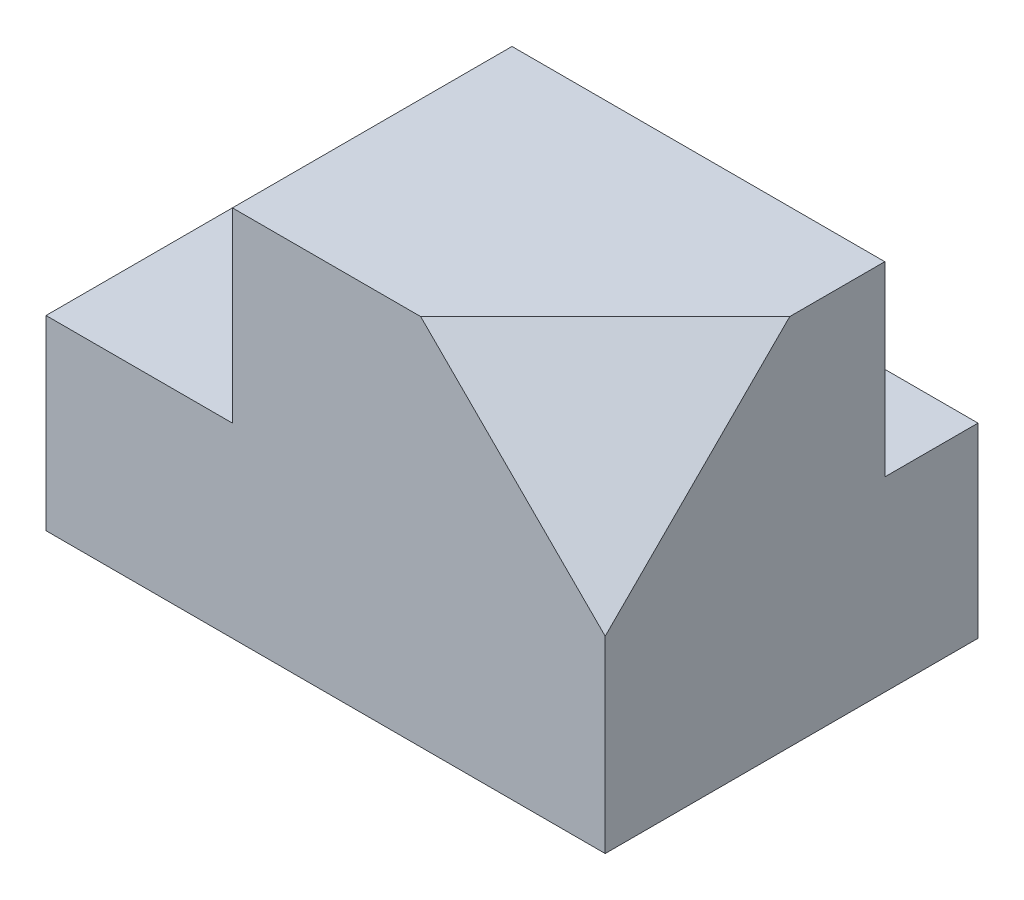
ISO-10303-21;
HEADER;
FILE_DESCRIPTION(('STEP AP214'),'2;1');
FILE_NAME('part.step','',(''),(''),'','','');
FILE_SCHEMA(('AUTOMOTIVE_DESIGN { 1 0 10303 214 1 1 1 1 }'));
ENDSEC;
DATA;
#1=APPLICATION_CONTEXT('core data for automotive mechanical design processes');
#2=APPLICATION_PROTOCOL_DEFINITION('international standard','automotive_design',2000,#1);
#3=PRODUCT_CONTEXT('',#1,'mechanical');
#4=PRODUCT('Part','Part','',(#3));
#5=PRODUCT_RELATED_PRODUCT_CATEGORY('part','',(#4));
#6=PRODUCT_DEFINITION_FORMATION('','',#4);
#7=PRODUCT_DEFINITION_CONTEXT('part definition',#1,'design');
#8=PRODUCT_DEFINITION('design','',#6,#7);
#9=PRODUCT_DEFINITION_SHAPE('','',#8);
#10=(LENGTH_UNIT() NAMED_UNIT(*) SI_UNIT(.MILLI.,.METRE.));
#11=(NAMED_UNIT(*) PLANE_ANGLE_UNIT() SI_UNIT($,.RADIAN.));
#12=(NAMED_UNIT(*) SI_UNIT($,.STERADIAN.) SOLID_ANGLE_UNIT());
#13=UNCERTAINTY_MEASURE_WITH_UNIT(LENGTH_MEASURE(1.E-05),#10,'distance_accuracy_value','');
#14=(GEOMETRIC_REPRESENTATION_CONTEXT(3) GLOBAL_UNCERTAINTY_ASSIGNED_CONTEXT((#13)) GLOBAL_UNIT_ASSIGNED_CONTEXT((#10,
#11,#12)) REPRESENTATION_CONTEXT('',''));
#15=CARTESIAN_POINT('',(0.,0.,0.));
#16=DIRECTION('',(0.,0.,1.));
#17=DIRECTION('',(1.,0.,0.));
#18=AXIS2_PLACEMENT_3D('',#15,#16,#17);
#19=CARTESIAN_POINT('',(0.,40.,0.));
#20=DIRECTION('',(0.,1.,0.));
#21=DIRECTION('',(0.,0.,1.));
#22=AXIS2_PLACEMENT_3D('',#19,#20,#21);
#23=PLANE('',#22);
#24=DIRECTION('',(1.,0.,0.));
#25=VECTOR('',#24,1.);
#26=CARTESIAN_POINT('',(30.,40.,20.));
#27=LINE('',#26,#25);
#28=CARTESIAN_POINT('',(-9.99999999999999,40.,20.));
#29=VERTEX_POINT('',#28);
#30=CARTESIAN_POINT('',(10.2,40.,20.));
#31=VERTEX_POINT('',#30);
#32=EDGE_CURVE('E110',#29,#31,#27,.T.);
#33=ORIENTED_EDGE('',*,*,#32,.T.);
#34=DIRECTION('',(0.707106781186547,0.,-0.707106781186547));
#35=VECTOR('',#34,1.);
#36=CARTESIAN_POINT('',(15.1,40.,15.1));
#37=LINE('',#36,#35);
#38=CARTESIAN_POINT('',(30.,40.,0.200000000000011));
#39=VERTEX_POINT('',#38);
#40=EDGE_CURVE('E11',#31,#39,#37,.T.);
#41=ORIENTED_EDGE('',*,*,#40,.T.);
#42=DIRECTION('',(0.,0.,-1.));
#43=VECTOR('',#42,1.);
#44=CARTESIAN_POINT('',(30.,40.,20.));
#45=LINE('',#44,#43);
#46=CARTESIAN_POINT('',(30.,40.,-9.99999999999999));
#47=VERTEX_POINT('',#46);
#48=EDGE_CURVE('E128',#39,#47,#45,.T.);
#49=ORIENTED_EDGE('',*,*,#48,.T.);
#50=DIRECTION('',(-1.,0.,0.));
#51=VECTOR('',#50,1.);
#52=CARTESIAN_POINT('',(30.,40.,-9.99999999999999));
#53=LINE('',#52,#51);
#54=CARTESIAN_POINT('',(-9.99999999999999,40.,-9.99999999999999));
#55=VERTEX_POINT('',#54);
#56=EDGE_CURVE('E120',#47,#55,#53,.T.);
#57=ORIENTED_EDGE('',*,*,#56,.T.);
#58=DIRECTION('',(0.,0.,1.));
#59=VECTOR('',#58,1.);
#60=CARTESIAN_POINT('',(-9.99999999999999,40.,20.));
#61=LINE('',#60,#59);
#62=EDGE_CURVE('E114',#55,#29,#61,.T.);
#63=ORIENTED_EDGE('',*,*,#62,.T.);
#64=EDGE_LOOP('',(#33,#41,#49,#57,#63));
#65=FACE_BOUND('',#64,.T.);
#66=ADVANCED_FACE('F39',(#65),#23,.T.);
#67=CARTESIAN_POINT('',(30.,20.,-20.));
#68=DIRECTION('',(-1.,0.,0.));
#69=DIRECTION('',(0.,0.,1.));
#70=AXIS2_PLACEMENT_3D('',#67,#68,#69);
#71=PLANE('',#70);
#72=DIRECTION('',(0.,0.707106781186547,-0.707106781186548));
#73=VECTOR('',#72,1.);
#74=CARTESIAN_POINT('',(30.,40.1,0.10000000000001));
#75=LINE('',#74,#73);
#76=CARTESIAN_POINT('',(30.,20.2,20.));
#77=VERTEX_POINT('',#76);
#78=EDGE_CURVE('E54',#77,#39,#75,.T.);
#79=ORIENTED_EDGE('',*,*,#78,.F.);
#80=DIRECTION('',(0.,-1.,0.));
#81=VECTOR('',#80,1.);
#82=CARTESIAN_POINT('',(30.,20.,20.));
#83=LINE('',#82,#81);
#84=CARTESIAN_POINT('',(30.,0.,20.));
#85=VERTEX_POINT('',#84);
#86=EDGE_CURVE('E112',#77,#85,#83,.T.);
#87=ORIENTED_EDGE('',*,*,#86,.T.);
#88=DIRECTION('',(0.,0.,-1.));
#89=VECTOR('',#88,1.);
#90=CARTESIAN_POINT('',(30.,0.,-20.));
#91=LINE('',#90,#89);
#92=CARTESIAN_POINT('',(30.,0.,-20.));
#93=VERTEX_POINT('',#92);
#94=EDGE_CURVE('E135',#85,#93,#91,.T.);
#95=ORIENTED_EDGE('',*,*,#94,.T.);
#96=DIRECTION('',(0.,-1.,0.));
#97=VECTOR('',#96,1.);
#98=CARTESIAN_POINT('',(30.,20.,-20.));
#99=LINE('',#98,#97);
#100=CARTESIAN_POINT('',(30.,20.,-20.));
#101=VERTEX_POINT('',#100);
#102=EDGE_CURVE('E158',#101,#93,#99,.T.);
#103=ORIENTED_EDGE('',*,*,#102,.F.);
#104=DIRECTION('',(0.,0.,-1.));
#105=VECTOR('',#104,1.);
#106=CARTESIAN_POINT('',(30.,20.,-20.));
#107=LINE('',#106,#105);
#108=CARTESIAN_POINT('',(30.,20.,-9.99999999999999));
#109=VERTEX_POINT('',#108);
#110=EDGE_CURVE('E136',#109,#101,#107,.T.);
#111=ORIENTED_EDGE('',*,*,#110,.F.);
#112=DIRECTION('',(0.,-1.,0.));
#113=VECTOR('',#112,1.);
#114=CARTESIAN_POINT('',(30.,40.,-9.99999999999999));
#115=LINE('',#114,#113);
#116=EDGE_CURVE('E132',#47,#109,#115,.T.);
#117=ORIENTED_EDGE('',*,*,#116,.F.);
#118=ORIENTED_EDGE('',*,*,#48,.F.);
#119=EDGE_LOOP('',(#79,#87,#95,#103,#111,#117,#118));
#120=FACE_BOUND('',#119,.T.);
#121=ADVANCED_FACE('F41',(#120),#71,.F.);
#122=CARTESIAN_POINT('',(-30.,20.,-20.));
#123=DIRECTION('',(0.,0.,1.));
#124=DIRECTION('',(1.,0.,0.));
#125=AXIS2_PLACEMENT_3D('',#122,#123,#124);
#126=PLANE('',#125);
#127=DIRECTION('',(-1.,0.,0.));
#128=VECTOR('',#127,1.);
#129=CARTESIAN_POINT('',(-30.,0.,-20.));
#130=LINE('',#129,#128);
#131=CARTESIAN_POINT('',(-30.,0.,-20.));
#132=VERTEX_POINT('',#131);
#133=EDGE_CURVE('E146',#93,#132,#130,.T.);
#134=ORIENTED_EDGE('',*,*,#133,.T.);
#135=DIRECTION('',(0.,-1.,0.));
#136=VECTOR('',#135,1.);
#137=CARTESIAN_POINT('',(-30.,20.,-20.));
#138=LINE('',#137,#136);
#139=CARTESIAN_POINT('',(-30.,20.,-20.));
#140=VERTEX_POINT('',#139);
#141=EDGE_CURVE('E155',#140,#132,#138,.T.);
#142=ORIENTED_EDGE('',*,*,#141,.F.);
#143=DIRECTION('',(-1.,0.,0.));
#144=VECTOR('',#143,1.);
#145=CARTESIAN_POINT('',(-30.,20.,-20.));
#146=LINE('',#145,#144);
#147=EDGE_CURVE('E138',#101,#140,#146,.T.);
#148=ORIENTED_EDGE('',*,*,#147,.F.);
#149=ORIENTED_EDGE('',*,*,#102,.T.);
#150=EDGE_LOOP('',(#134,#142,#148,#149));
#151=FACE_BOUND('',#150,.T.);
#152=ADVANCED_FACE('F164',(#151),#126,.F.);
#153=CARTESIAN_POINT('',(-30.,20.,-20.));
#154=DIRECTION('',(1.,0.,0.));
#155=DIRECTION('',(0.,0.,-1.));
#156=AXIS2_PLACEMENT_3D('',#153,#154,#155);
#157=PLANE('',#156);
#158=DIRECTION('',(0.,0.,1.));
#159=VECTOR('',#158,1.);
#160=CARTESIAN_POINT('',(-30.,0.,-20.));
#161=LINE('',#160,#159);
#162=CARTESIAN_POINT('',(-30.,0.,20.));
#163=VERTEX_POINT('',#162);
#164=EDGE_CURVE('E148',#132,#163,#161,.T.);
#165=ORIENTED_EDGE('',*,*,#164,.T.);
#166=DIRECTION('',(0.,-1.,0.));
#167=VECTOR('',#166,1.);
#168=CARTESIAN_POINT('',(-30.,20.,20.));
#169=LINE('',#168,#167);
#170=CARTESIAN_POINT('',(-30.,20.,20.));
#171=VERTEX_POINT('',#170);
#172=EDGE_CURVE('E152',#171,#163,#169,.T.);
#173=ORIENTED_EDGE('',*,*,#172,.F.);
#174=DIRECTION('',(0.,0.,1.));
#175=VECTOR('',#174,1.);
#176=CARTESIAN_POINT('',(-30.,20.,-20.));
#177=LINE('',#176,#175);
#178=EDGE_CURVE('E141',#140,#171,#177,.T.);
#179=ORIENTED_EDGE('',*,*,#178,.F.);
#180=ORIENTED_EDGE('',*,*,#141,.T.);
#181=EDGE_LOOP('',(#165,#173,#179,#180));
#182=FACE_BOUND('',#181,.T.);
#183=ADVANCED_FACE('F175',(#182),#157,.F.);
#184=CARTESIAN_POINT('',(-30.,20.,20.));
#185=DIRECTION('',(0.,0.,-1.));
#186=DIRECTION('',(-1.,0.,0.));
#187=AXIS2_PLACEMENT_3D('',#184,#185,#186);
#188=PLANE('',#187);
#189=DIRECTION('',(0.707106781186548,-0.707106781186547,0.));
#190=VECTOR('',#189,1.);
#191=CARTESIAN_POINT('',(0.100000000000006,50.1,20.));
#192=LINE('',#191,#190);
#193=EDGE_CURVE('E47',#31,#77,#192,.T.);
#194=ORIENTED_EDGE('',*,*,#193,.F.);
#195=ORIENTED_EDGE('',*,*,#32,.F.);
#196=DIRECTION('',(0.,-1.,0.));
#197=VECTOR('',#196,1.);
#198=CARTESIAN_POINT('',(-9.99999999999999,40.,20.));
#199=LINE('',#198,#197);
#200=CARTESIAN_POINT('',(-9.99999999999999,20.,20.));
#201=VERTEX_POINT('',#200);
#202=EDGE_CURVE('E116',#29,#201,#199,.T.);
#203=ORIENTED_EDGE('',*,*,#202,.T.);
#204=DIRECTION('',(1.,0.,0.));
#205=VECTOR('',#204,1.);
#206=CARTESIAN_POINT('',(-30.,20.,20.));
#207=LINE('',#206,#205);
#208=EDGE_CURVE('E61',#171,#201,#207,.T.);
#209=ORIENTED_EDGE('',*,*,#208,.F.);
#210=ORIENTED_EDGE('',*,*,#172,.T.);
#211=DIRECTION('',(1.,0.,0.));
#212=VECTOR('',#211,1.);
#213=CARTESIAN_POINT('',(-30.,0.,20.));
#214=LINE('',#213,#212);
#215=EDGE_CURVE('E139',#163,#85,#214,.T.);
#216=ORIENTED_EDGE('',*,*,#215,.T.);
#217=ORIENTED_EDGE('',*,*,#86,.F.);
#218=EDGE_LOOP('',(#194,#195,#203,#209,#210,#216,#217));
#219=FACE_BOUND('',#218,.T.);
#220=ADVANCED_FACE('F108',(#219),#188,.F.);
#221=CARTESIAN_POINT('',(0.,20.,0.));
#222=DIRECTION('',(0.,1.,0.));
#223=DIRECTION('',(0.,0.,1.));
#224=AXIS2_PLACEMENT_3D('',#221,#222,#223);
#225=PLANE('',#224);
#226=DIRECTION('',(0.,0.,1.));
#227=VECTOR('',#226,1.);
#228=CARTESIAN_POINT('',(-9.99999999999999,20.,20.));
#229=LINE('',#228,#227);
#230=CARTESIAN_POINT('',(-9.99999999999999,20.,-9.99999999999999));
#231=VERTEX_POINT('',#230);
#232=EDGE_CURVE('E127',#231,#201,#229,.T.);
#233=ORIENTED_EDGE('',*,*,#232,.F.);
#234=DIRECTION('',(-1.,0.,0.));
#235=VECTOR('',#234,1.);
#236=CARTESIAN_POINT('',(30.,20.,-9.99999999999999));
#237=LINE('',#236,#235);
#238=EDGE_CURVE('E124',#109,#231,#237,.T.);
#239=ORIENTED_EDGE('',*,*,#238,.F.);
#240=ORIENTED_EDGE('',*,*,#110,.T.);
#241=ORIENTED_EDGE('',*,*,#147,.T.);
#242=ORIENTED_EDGE('',*,*,#178,.T.);
#243=ORIENTED_EDGE('',*,*,#208,.T.);
#244=EDGE_LOOP('',(#233,#239,#240,#241,#242,#243));
#245=FACE_BOUND('',#244,.T.);
#246=ADVANCED_FACE('F180',(#245),#225,.T.);
#247=CARTESIAN_POINT('',(0.,0.,0.));
#248=DIRECTION('',(0.,1.,0.));
#249=DIRECTION('',(0.,0.,1.));
#250=AXIS2_PLACEMENT_3D('',#247,#248,#249);
#251=PLANE('',#250);
#252=ORIENTED_EDGE('',*,*,#94,.F.);
#253=ORIENTED_EDGE('',*,*,#215,.F.);
#254=ORIENTED_EDGE('',*,*,#164,.F.);
#255=ORIENTED_EDGE('',*,*,#133,.F.);
#256=EDGE_LOOP('',(#252,#253,#254,#255));
#257=FACE_BOUND('',#256,.T.);
#258=ADVANCED_FACE('F171',(#257),#251,.F.);
#259=CARTESIAN_POINT('',(30.,40.,-9.99999999999999));
#260=DIRECTION('',(0.,0.,1.));
#261=DIRECTION('',(1.,0.,0.));
#262=AXIS2_PLACEMENT_3D('',#259,#260,#261);
#263=PLANE('',#262);
#264=ORIENTED_EDGE('',*,*,#238,.T.);
#265=DIRECTION('',(0.,-1.,0.));
#266=VECTOR('',#265,1.);
#267=CARTESIAN_POINT('',(-9.99999999999999,40.,-9.99999999999999));
#268=LINE('',#267,#266);
#269=EDGE_CURVE('E118',#55,#231,#268,.T.);
#270=ORIENTED_EDGE('',*,*,#269,.F.);
#271=ORIENTED_EDGE('',*,*,#56,.F.);
#272=ORIENTED_EDGE('',*,*,#116,.T.);
#273=EDGE_LOOP('',(#264,#270,#271,#272));
#274=FACE_BOUND('',#273,.T.);
#275=ADVANCED_FACE('F182',(#274),#263,.F.);
#276=CARTESIAN_POINT('',(-9.99999999999999,40.,20.));
#277=DIRECTION('',(1.,0.,0.));
#278=DIRECTION('',(0.,0.,-1.));
#279=AXIS2_PLACEMENT_3D('',#276,#277,#278);
#280=PLANE('',#279);
#281=ORIENTED_EDGE('',*,*,#232,.T.);
#282=ORIENTED_EDGE('',*,*,#202,.F.);
#283=ORIENTED_EDGE('',*,*,#62,.F.);
#284=ORIENTED_EDGE('',*,*,#269,.T.);
#285=EDGE_LOOP('',(#281,#282,#283,#284));
#286=FACE_BOUND('',#285,.T.);
#287=ADVANCED_FACE('F178',(#286),#280,.F.);
#288=CARTESIAN_POINT('',(23.4,23.4,23.4));
#289=DIRECTION('',(0.577350269189626,0.577350269189626,0.577350269189626));
#290=DIRECTION('',(0.,-0.707106781186547,0.707106781186548));
#291=AXIS2_PLACEMENT_3D('',#288,#289,#290);
#292=PLANE('',#291);
#293=ORIENTED_EDGE('',*,*,#193,.T.);
#294=ORIENTED_EDGE('',*,*,#78,.T.);
#295=ORIENTED_EDGE('',*,*,#40,.F.);
#296=EDGE_LOOP('',(#293,#294,#295));
#297=FACE_BOUND('',#296,.T.);
#298=ADVANCED_FACE('F101',(#297),#292,.T.);
#299=CLOSED_SHELL('',(#66,#121,#152,#183,#220,#246,#258,#275,#287,#298));
#300=MANIFOLD_SOLID_BREP('B2',#299);
#301=ADVANCED_BREP_SHAPE_REPRESENTATION('',(#18,#300),#14);
#302=SHAPE_DEFINITION_REPRESENTATION(#9,#301);
ENDSEC;
END-ISO-10303-21;
